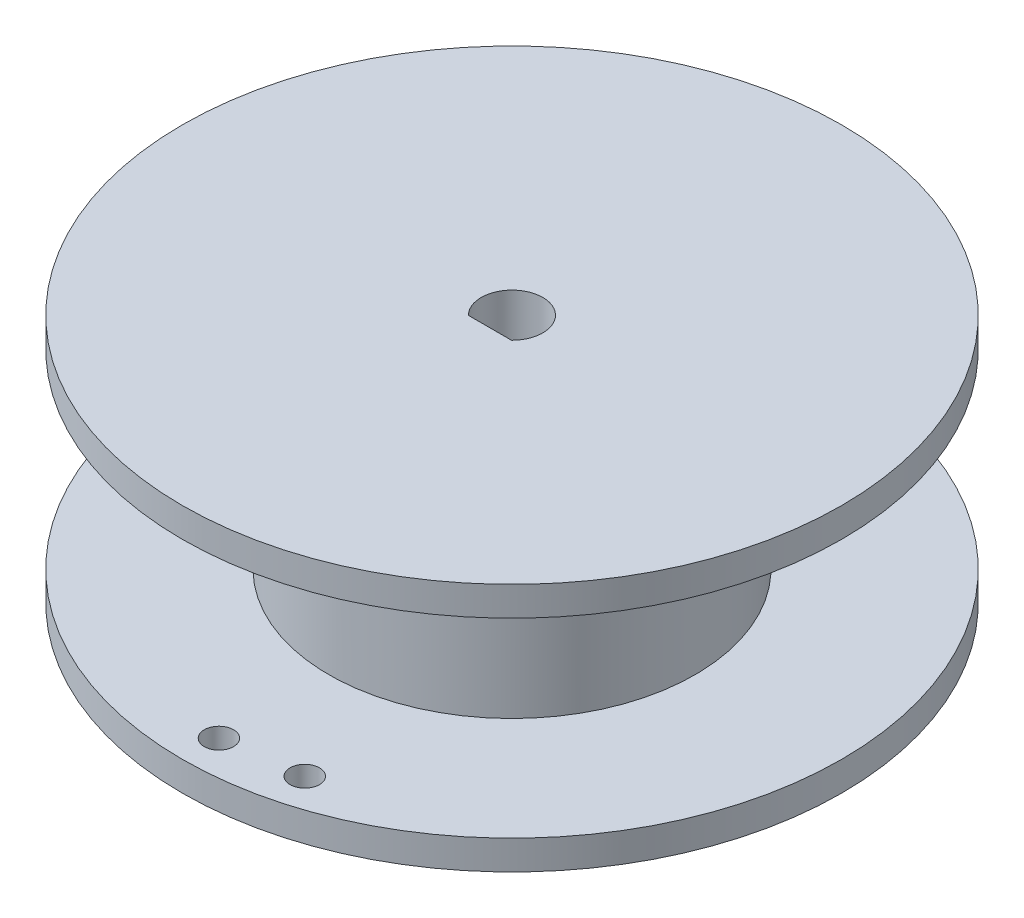
ISO-10303-21;
HEADER;
FILE_DESCRIPTION(('STEP AP214'),'2;1');
FILE_NAME('part.step','',(''),(''),'','','');
FILE_SCHEMA(('AUTOMOTIVE_DESIGN { 1 0 10303 214 1 1 1 1 }'));
ENDSEC;
DATA;
#1=APPLICATION_CONTEXT('core data for automotive mechanical design processes');
#2=APPLICATION_PROTOCOL_DEFINITION('international standard','automotive_design',2000,#1);
#3=PRODUCT_CONTEXT('',#1,'mechanical');
#4=PRODUCT('Part','Part','',(#3));
#5=PRODUCT_RELATED_PRODUCT_CATEGORY('part','',(#4));
#6=PRODUCT_DEFINITION_FORMATION('','',#4);
#7=PRODUCT_DEFINITION_CONTEXT('part definition',#1,'design');
#8=PRODUCT_DEFINITION('design','',#6,#7);
#9=PRODUCT_DEFINITION_SHAPE('','',#8);
#10=(LENGTH_UNIT() NAMED_UNIT(*) SI_UNIT(.MILLI.,.METRE.));
#11=(NAMED_UNIT(*) PLANE_ANGLE_UNIT() SI_UNIT($,.RADIAN.));
#12=(NAMED_UNIT(*) SI_UNIT($,.STERADIAN.) SOLID_ANGLE_UNIT());
#13=UNCERTAINTY_MEASURE_WITH_UNIT(LENGTH_MEASURE(1.E-05),#10,'distance_accuracy_value','');
#14=(GEOMETRIC_REPRESENTATION_CONTEXT(3) GLOBAL_UNCERTAINTY_ASSIGNED_CONTEXT((#13)) GLOBAL_UNIT_ASSIGNED_CONTEXT((#10,
#11,#12)) REPRESENTATION_CONTEXT('',''));
#15=CARTESIAN_POINT('',(0.,0.,0.));
#16=DIRECTION('',(0.,0.,1.));
#17=DIRECTION('',(1.,0.,0.));
#18=AXIS2_PLACEMENT_3D('',#15,#16,#17);
#19=CARTESIAN_POINT('',(0.,15.,0.));
#20=DIRECTION('',(0.,-1.,0.));
#21=DIRECTION('',(0.,0.,-1.));
#22=AXIS2_PLACEMENT_3D('',#19,#20,#21);
#23=CYLINDRICAL_SURFACE('',#22,12.5);
#24=CARTESIAN_POINT('',(0.,15.,0.));
#25=DIRECTION('',(0.,1.,0.));
#26=DIRECTION('',(0.,0.,1.));
#27=AXIS2_PLACEMENT_3D('',#24,#25,#26);
#28=CIRCLE('',#27,12.5);
#29=CARTESIAN_POINT('',(0.,15.,12.5));
#30=VERTEX_POINT('',#29);
#31=EDGE_CURVE('E42',#30,#30,#28,.T.);
#32=ORIENTED_EDGE('',*,*,#31,.F.);
#33=EDGE_LOOP('',(#32));
#34=FACE_BOUND('',#33,.T.);
#35=CARTESIAN_POINT('',(0.,2.,0.));
#36=DIRECTION('',(0.,-1.,0.));
#37=DIRECTION('',(0.,0.,-1.));
#38=AXIS2_PLACEMENT_3D('',#35,#36,#37);
#39=CIRCLE('',#38,12.5);
#40=CARTESIAN_POINT('',(0.,2.,-12.5));
#41=VERTEX_POINT('',#40);
#42=EDGE_CURVE('E11',#41,#41,#39,.T.);
#43=ORIENTED_EDGE('',*,*,#42,.F.);
#44=EDGE_LOOP('',(#43));
#45=FACE_BOUND('',#44,.T.);
#46=ADVANCED_FACE('F41',(#34,#45),#23,.T.);
#47=CARTESIAN_POINT('',(0.,0.,0.));
#48=DIRECTION('',(0.,1.,0.));
#49=DIRECTION('',(0.,0.,1.));
#50=AXIS2_PLACEMENT_3D('',#47,#48,#49);
#51=PLANE('',#50);
#52=CARTESIAN_POINT('',(0.,0.,0.));
#53=DIRECTION('',(0.,1.,0.));
#54=DIRECTION('',(0.,0.,1.));
#55=AXIS2_PLACEMENT_3D('',#52,#53,#54);
#56=CIRCLE('',#55,2.1);
#57=CARTESIAN_POINT('',(1.46969384566991,0.,1.5));
#58=VERTEX_POINT('',#57);
#59=CARTESIAN_POINT('',(-1.46969384566991,0.,1.5));
#60=VERTEX_POINT('',#59);
#61=EDGE_CURVE('E75',#58,#60,#56,.T.);
#62=ORIENTED_EDGE('',*,*,#61,.T.);
#63=DIRECTION('',(1.,0.,0.));
#64=VECTOR('',#63,1.);
#65=CARTESIAN_POINT('',(-1.46969384566991,0.,1.5));
#66=LINE('',#65,#64);
#67=EDGE_CURVE('E74',#60,#58,#66,.T.);
#68=ORIENTED_EDGE('',*,*,#67,.T.);
#69=EDGE_LOOP('',(#62,#68));
#70=FACE_BOUND('',#69,.T.);
#71=CARTESIAN_POINT('',(5.17638090205071,0.,19.3185165257823));
#72=DIRECTION('',(0.,-1.,0.));
#73=DIRECTION('',(0.,0.,-1.));
#74=AXIS2_PLACEMENT_3D('',#71,#72,#73);
#75=CIRCLE('',#74,1.);
#76=CARTESIAN_POINT('',(5.17638090205071,0.,18.3185165257823));
#77=VERTEX_POINT('',#76);
#78=EDGE_CURVE('E90',#77,#77,#75,.T.);
#79=ORIENTED_EDGE('',*,*,#78,.F.);
#80=EDGE_LOOP('',(#79));
#81=FACE_BOUND('',#80,.T.);
#82=CARTESIAN_POINT('',(0.,0.,20.));
#83=DIRECTION('',(0.,-1.,0.));
#84=DIRECTION('',(0.,0.,-1.));
#85=AXIS2_PLACEMENT_3D('',#82,#83,#84);
#86=CIRCLE('',#85,1.);
#87=CARTESIAN_POINT('',(0.,0.,19.));
#88=VERTEX_POINT('',#87);
#89=EDGE_CURVE('E93',#88,#88,#86,.T.);
#90=ORIENTED_EDGE('',*,*,#89,.F.);
#91=EDGE_LOOP('',(#90));
#92=FACE_BOUND('',#91,.T.);
#93=CARTESIAN_POINT('',(0.,0.,0.));
#94=DIRECTION('',(0.,-1.,0.));
#95=DIRECTION('',(0.,0.,-1.));
#96=AXIS2_PLACEMENT_3D('',#93,#94,#95);
#97=CIRCLE('',#96,22.5);
#98=CARTESIAN_POINT('',(0.,0.,-22.5));
#99=VERTEX_POINT('',#98);
#100=EDGE_CURVE('E100',#99,#99,#97,.T.);
#101=ORIENTED_EDGE('',*,*,#100,.T.);
#102=EDGE_LOOP('',(#101));
#103=FACE_BOUND('',#102,.T.);
#104=ADVANCED_FACE('F116',(#70,#81,#92,#103),#51,.F.);
#105=CARTESIAN_POINT('',(0.,15.,0.));
#106=DIRECTION('',(0.,-1.,0.));
#107=DIRECTION('',(0.,0.,-1.));
#108=AXIS2_PLACEMENT_3D('',#105,#106,#107);
#109=CYLINDRICAL_SURFACE('',#108,2.1);
#110=ORIENTED_EDGE('',*,*,#61,.F.);
#111=DIRECTION('',(0.,-1.,0.));
#112=VECTOR('',#111,1.);
#113=CARTESIAN_POINT('',(1.46969384566991,15.,1.5));
#114=LINE('',#113,#112);
#115=CARTESIAN_POINT('',(1.46969384566991,17.,1.5));
#116=VERTEX_POINT('',#115);
#117=EDGE_CURVE('E57',#116,#58,#114,.T.);
#118=ORIENTED_EDGE('',*,*,#117,.F.);
#119=CARTESIAN_POINT('',(0.,17.,0.));
#120=DIRECTION('',(0.,1.,0.));
#121=DIRECTION('',(0.,0.,1.));
#122=AXIS2_PLACEMENT_3D('',#119,#120,#121);
#123=CIRCLE('',#122,2.1);
#124=CARTESIAN_POINT('',(-1.46969384566991,17.,1.5));
#125=VERTEX_POINT('',#124);
#126=EDGE_CURVE('E68',#116,#125,#123,.T.);
#127=ORIENTED_EDGE('',*,*,#126,.T.);
#128=DIRECTION('',(0.,-1.,0.));
#129=VECTOR('',#128,1.);
#130=CARTESIAN_POINT('',(-1.46969384566991,15.,1.5));
#131=LINE('',#130,#129);
#132=EDGE_CURVE('E64',#125,#60,#131,.T.);
#133=ORIENTED_EDGE('',*,*,#132,.T.);
#134=EDGE_LOOP('',(#110,#118,#127,#133));
#135=FACE_BOUND('',#134,.T.);
#136=ADVANCED_FACE('F70',(#135),#109,.F.);
#137=CARTESIAN_POINT('',(-1.46969384566991,15.,1.5));
#138=DIRECTION('',(0.,0.,-1.));
#139=DIRECTION('',(-1.,0.,0.));
#140=AXIS2_PLACEMENT_3D('',#137,#138,#139);
#141=PLANE('',#140);
#142=ORIENTED_EDGE('',*,*,#67,.F.);
#143=ORIENTED_EDGE('',*,*,#132,.F.);
#144=DIRECTION('',(1.,0.,0.));
#145=VECTOR('',#144,1.);
#146=CARTESIAN_POINT('',(-1.46969384566991,17.,1.5));
#147=LINE('',#146,#145);
#148=EDGE_CURVE('E77',#125,#116,#147,.T.);
#149=ORIENTED_EDGE('',*,*,#148,.T.);
#150=ORIENTED_EDGE('',*,*,#117,.T.);
#151=EDGE_LOOP('',(#142,#143,#149,#150));
#152=FACE_BOUND('',#151,.T.);
#153=ADVANCED_FACE('F80',(#152),#141,.T.);
#154=CARTESIAN_POINT('',(0.,2.,0.));
#155=DIRECTION('',(0.,-1.,0.));
#156=DIRECTION('',(0.,0.,-1.));
#157=AXIS2_PLACEMENT_3D('',#154,#155,#156);
#158=CYLINDRICAL_SURFACE('',#157,22.5);
#159=CARTESIAN_POINT('',(0.,2.,0.));
#160=DIRECTION('',(0.,-1.,0.));
#161=DIRECTION('',(0.,0.,-1.));
#162=AXIS2_PLACEMENT_3D('',#159,#160,#161);
#163=CIRCLE('',#162,22.5);
#164=CARTESIAN_POINT('',(0.,2.,-22.5));
#165=VERTEX_POINT('',#164);
#166=EDGE_CURVE('E105',#165,#165,#163,.T.);
#167=ORIENTED_EDGE('',*,*,#166,.T.);
#168=EDGE_LOOP('',(#167));
#169=FACE_BOUND('',#168,.T.);
#170=ORIENTED_EDGE('',*,*,#100,.F.);
#171=EDGE_LOOP('',(#170));
#172=FACE_BOUND('',#171,.T.);
#173=ADVANCED_FACE('F124',(#169,#172),#158,.T.);
#174=CARTESIAN_POINT('',(0.,2.,0.));
#175=DIRECTION('',(0.,-1.,0.));
#176=DIRECTION('',(0.,0.,-1.));
#177=AXIS2_PLACEMENT_3D('',#174,#175,#176);
#178=PLANE('',#177);
#179=ORIENTED_EDGE('',*,*,#42,.T.);
#180=EDGE_LOOP('',(#179));
#181=FACE_BOUND('',#180,.T.);
#182=CARTESIAN_POINT('',(5.17638090205071,2.,19.3185165257823));
#183=DIRECTION('',(0.,-1.,0.));
#184=DIRECTION('',(0.,0.,-1.));
#185=AXIS2_PLACEMENT_3D('',#182,#183,#184);
#186=CIRCLE('',#185,1.);
#187=CARTESIAN_POINT('',(5.17638090205071,2.,18.3185165257823));
#188=VERTEX_POINT('',#187);
#189=EDGE_CURVE('E89',#188,#188,#186,.T.);
#190=ORIENTED_EDGE('',*,*,#189,.T.);
#191=EDGE_LOOP('',(#190));
#192=FACE_BOUND('',#191,.T.);
#193=CARTESIAN_POINT('',(0.,2.,20.));
#194=DIRECTION('',(0.,-1.,0.));
#195=DIRECTION('',(0.,0.,-1.));
#196=AXIS2_PLACEMENT_3D('',#193,#194,#195);
#197=CIRCLE('',#196,1.);
#198=CARTESIAN_POINT('',(0.,2.,19.));
#199=VERTEX_POINT('',#198);
#200=EDGE_CURVE('E98',#199,#199,#197,.T.);
#201=ORIENTED_EDGE('',*,*,#200,.T.);
#202=EDGE_LOOP('',(#201));
#203=FACE_BOUND('',#202,.T.);
#204=ORIENTED_EDGE('',*,*,#166,.F.);
#205=EDGE_LOOP('',(#204));
#206=FACE_BOUND('',#205,.T.);
#207=ADVANCED_FACE('F118',(#181,#192,#203,#206),#178,.F.);
#208=CARTESIAN_POINT('',(0.,2.,20.));
#209=DIRECTION('',(0.,-1.,0.));
#210=DIRECTION('',(0.,0.,-1.));
#211=AXIS2_PLACEMENT_3D('',#208,#209,#210);
#212=CYLINDRICAL_SURFACE('',#211,1.);
#213=ORIENTED_EDGE('',*,*,#200,.F.);
#214=EDGE_LOOP('',(#213));
#215=FACE_BOUND('',#214,.T.);
#216=ORIENTED_EDGE('',*,*,#89,.T.);
#217=EDGE_LOOP('',(#216));
#218=FACE_BOUND('',#217,.T.);
#219=ADVANCED_FACE('F125',(#215,#218),#212,.F.);
#220=CARTESIAN_POINT('',(5.17638090205071,2.,19.3185165257823));
#221=DIRECTION('',(0.,-1.,0.));
#222=DIRECTION('',(0.,0.,-1.));
#223=AXIS2_PLACEMENT_3D('',#220,#221,#222);
#224=CYLINDRICAL_SURFACE('',#223,1.);
#225=ORIENTED_EDGE('',*,*,#189,.F.);
#226=EDGE_LOOP('',(#225));
#227=FACE_BOUND('',#226,.T.);
#228=ORIENTED_EDGE('',*,*,#78,.T.);
#229=EDGE_LOOP('',(#228));
#230=FACE_BOUND('',#229,.T.);
#231=ADVANCED_FACE('F149',(#227,#230),#224,.F.);
#232=CARTESIAN_POINT('',(0.,17.,0.));
#233=DIRECTION('',(0.,1.,0.));
#234=DIRECTION('',(0.,0.,1.));
#235=AXIS2_PLACEMENT_3D('',#232,#233,#234);
#236=PLANE('',#235);
#237=CARTESIAN_POINT('',(0.,17.,0.));
#238=DIRECTION('',(0.,1.,0.));
#239=DIRECTION('',(0.,0.,1.));
#240=AXIS2_PLACEMENT_3D('',#237,#238,#239);
#241=CIRCLE('',#240,22.5);
#242=CARTESIAN_POINT('',(0.,17.,22.5));
#243=VERTEX_POINT('',#242);
#244=EDGE_CURVE('E81',#243,#243,#241,.T.);
#245=ORIENTED_EDGE('',*,*,#244,.T.);
#246=EDGE_LOOP('',(#245));
#247=FACE_BOUND('',#246,.T.);
#248=ORIENTED_EDGE('',*,*,#148,.F.);
#249=ORIENTED_EDGE('',*,*,#126,.F.);
#250=EDGE_LOOP('',(#248,#249));
#251=FACE_BOUND('',#250,.T.);
#252=ADVANCED_FACE('F82',(#247,#251),#236,.T.);
#253=CARTESIAN_POINT('',(0.,15.,0.));
#254=DIRECTION('',(0.,1.,0.));
#255=DIRECTION('',(0.,0.,1.));
#256=AXIS2_PLACEMENT_3D('',#253,#254,#255);
#257=PLANE('',#256);
#258=ORIENTED_EDGE('',*,*,#31,.T.);
#259=EDGE_LOOP('',(#258));
#260=FACE_BOUND('',#259,.T.);
#261=CARTESIAN_POINT('',(0.,15.,0.));
#262=DIRECTION('',(0.,1.,0.));
#263=DIRECTION('',(0.,0.,1.));
#264=AXIS2_PLACEMENT_3D('',#261,#262,#263);
#265=CIRCLE('',#264,22.5);
#266=CARTESIAN_POINT('',(0.,15.,22.5));
#267=VERTEX_POINT('',#266);
#268=EDGE_CURVE('E79',#267,#267,#265,.T.);
#269=ORIENTED_EDGE('',*,*,#268,.F.);
#270=EDGE_LOOP('',(#269));
#271=FACE_BOUND('',#270,.T.);
#272=ADVANCED_FACE('F111',(#260,#271),#257,.F.);
#273=CARTESIAN_POINT('',(0.,17.,0.));
#274=DIRECTION('',(0.,-1.,0.));
#275=DIRECTION('',(0.,0.,-1.));
#276=AXIS2_PLACEMENT_3D('',#273,#274,#275);
#277=CYLINDRICAL_SURFACE('',#276,22.5);
#278=ORIENTED_EDGE('',*,*,#244,.F.);
#279=EDGE_LOOP('',(#278));
#280=FACE_BOUND('',#279,.T.);
#281=ORIENTED_EDGE('',*,*,#268,.T.);
#282=EDGE_LOOP('',(#281));
#283=FACE_BOUND('',#282,.T.);
#284=ADVANCED_FACE('F152',(#280,#283),#277,.T.);
#285=CLOSED_SHELL('',(#46,#104,#136,#153,#173,#207,#219,#231,#252,#272,#284));
#286=MANIFOLD_SOLID_BREP('B2',#285);
#287=ADVANCED_BREP_SHAPE_REPRESENTATION('',(#18,#286),#14);
#288=SHAPE_DEFINITION_REPRESENTATION(#9,#287);
ENDSEC;
END-ISO-10303-21;
